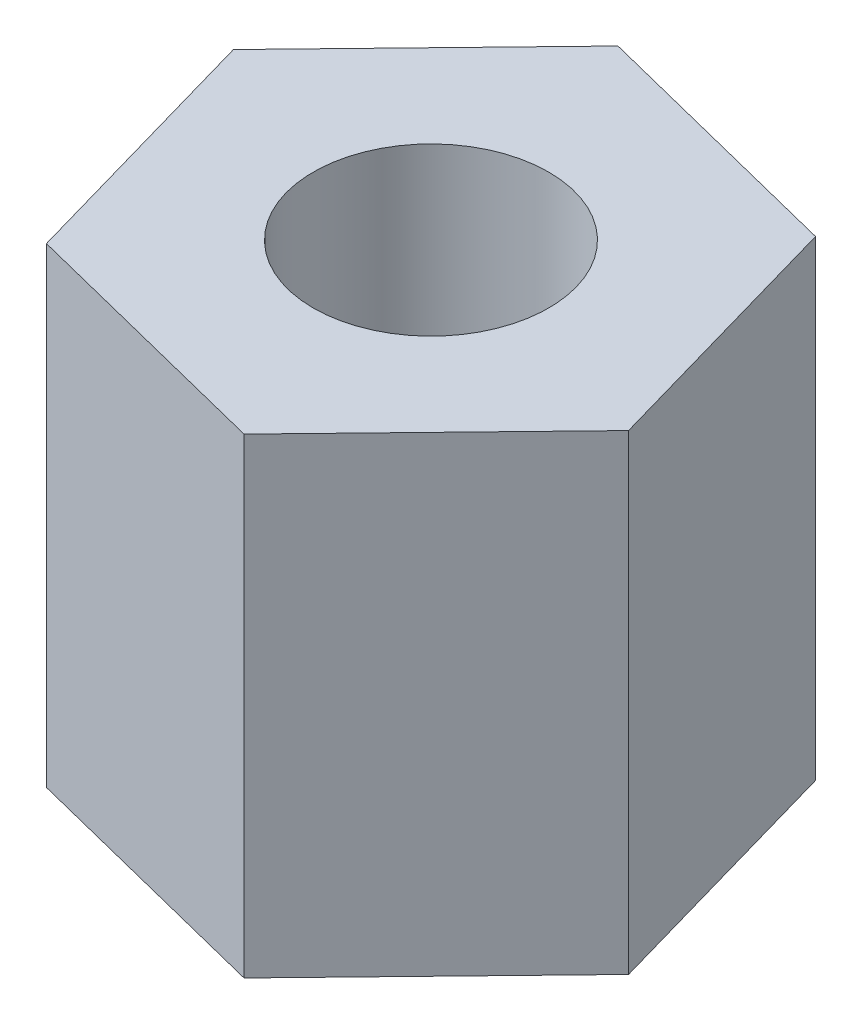
ISO-10303-21;
HEADER;
FILE_DESCRIPTION(('STEP AP214'),'2;1');
FILE_NAME('part.step','',(''),(''),'','','');
FILE_SCHEMA(('AUTOMOTIVE_DESIGN { 1 0 10303 214 1 1 1 1 }'));
ENDSEC;
DATA;
#1=APPLICATION_CONTEXT('core data for automotive mechanical design processes');
#2=APPLICATION_PROTOCOL_DEFINITION('international standard','automotive_design',2000,#1);
#3=PRODUCT_CONTEXT('',#1,'mechanical');
#4=PRODUCT('Part','Part','',(#3));
#5=PRODUCT_RELATED_PRODUCT_CATEGORY('part','',(#4));
#6=PRODUCT_DEFINITION_FORMATION('','',#4);
#7=PRODUCT_DEFINITION_CONTEXT('part definition',#1,'design');
#8=PRODUCT_DEFINITION('design','',#6,#7);
#9=PRODUCT_DEFINITION_SHAPE('','',#8);
#10=(LENGTH_UNIT() NAMED_UNIT(*) SI_UNIT(.MILLI.,.METRE.));
#11=(NAMED_UNIT(*) PLANE_ANGLE_UNIT() SI_UNIT($,.RADIAN.));
#12=(NAMED_UNIT(*) SI_UNIT($,.STERADIAN.) SOLID_ANGLE_UNIT());
#13=UNCERTAINTY_MEASURE_WITH_UNIT(LENGTH_MEASURE(1.E-05),#10,'distance_accuracy_value','');
#14=(GEOMETRIC_REPRESENTATION_CONTEXT(3) GLOBAL_UNCERTAINTY_ASSIGNED_CONTEXT((#13)) GLOBAL_UNIT_ASSIGNED_CONTEXT((#10,
#11,#12)) REPRESENTATION_CONTEXT('',''));
#15=CARTESIAN_POINT('',(0.,0.,0.));
#16=DIRECTION('',(0.,0.,1.));
#17=DIRECTION('',(1.,0.,0.));
#18=AXIS2_PLACEMENT_3D('',#15,#16,#17);
#19=CARTESIAN_POINT('',(0.,10.,0.));
#20=DIRECTION('',(0.,1.,0.));
#21=DIRECTION('',(0.,0.,1.));
#22=AXIS2_PLACEMENT_3D('',#19,#20,#21);
#23=PLANE('',#22);
#24=DIRECTION('',(-0.69571755837201,0.,0.718315445311381));
#25=VECTOR('',#24,1.);
#26=CARTESIAN_POINT('',(-1.58321362852676,10.,-5.55218587042801));
#27=LINE('',#26,#25);
#28=CARTESIAN_POINT('',(-1.58321362852676,10.,-5.55218587042801));
#29=VERTEX_POINT('',#28);
#30=CARTESIAN_POINT('',(-5.59994082458705,10.,-1.40498971329209));
#31=VERTEX_POINT('',#30);
#32=EDGE_CURVE('E128',#29,#31,#27,.T.);
#33=ORIENTED_EDGE('',*,*,#32,.T.);
#34=DIRECTION('',(0.274220644384383,0.,0.961666802064735));
#35=VECTOR('',#34,1.);
#36=CARTESIAN_POINT('',(-5.59994082458705,10.,-1.40498971329209));
#37=LINE('',#36,#35);
#38=CARTESIAN_POINT('',(-4.01672719606029,10.,4.14719615713592));
#39=VERTEX_POINT('',#38);
#40=EDGE_CURVE('E86',#31,#39,#37,.T.);
#41=ORIENTED_EDGE('',*,*,#40,.T.);
#42=DIRECTION('',(0.969938202756393,0.,0.243351356753353));
#43=VECTOR('',#42,1.);
#44=CARTESIAN_POINT('',(-4.01672719606029,10.,4.14719615713592));
#45=LINE('',#44,#43);
#46=CARTESIAN_POINT('',(1.58321362852677,10.,5.55218587042801));
#47=VERTEX_POINT('',#46);
#48=EDGE_CURVE('E99',#39,#47,#45,.T.);
#49=ORIENTED_EDGE('',*,*,#48,.T.);
#50=DIRECTION('',(0.69571755837201,0.,-0.718315445311382));
#51=VECTOR('',#50,1.);
#52=CARTESIAN_POINT('',(1.58321362852677,10.,5.55218587042801));
#53=LINE('',#52,#51);
#54=CARTESIAN_POINT('',(5.59994082458706,10.,1.4049897132921));
#55=VERTEX_POINT('',#54);
#56=EDGE_CURVE('E93',#47,#55,#53,.T.);
#57=ORIENTED_EDGE('',*,*,#56,.T.);
#58=DIRECTION('',(-0.274220644384383,0.,-0.961666802064735));
#59=VECTOR('',#58,1.);
#60=CARTESIAN_POINT('',(5.59994082458706,10.,1.4049897132921));
#61=LINE('',#60,#59);
#62=CARTESIAN_POINT('',(4.01672719606029,10.,-4.14719615713592));
#63=VERTEX_POINT('',#62);
#64=EDGE_CURVE('E97',#55,#63,#61,.T.);
#65=ORIENTED_EDGE('',*,*,#64,.T.);
#66=DIRECTION('',(-0.969938202756393,0.,-0.243351356753353));
#67=VECTOR('',#66,1.);
#68=CARTESIAN_POINT('',(4.01672719606029,10.,-4.14719615713592));
#69=LINE('',#68,#67);
#70=EDGE_CURVE('E49',#63,#29,#69,.T.);
#71=ORIENTED_EDGE('',*,*,#70,.T.);
#72=EDGE_LOOP('',(#33,#41,#49,#57,#65,#71));
#73=FACE_BOUND('',#72,.T.);
#74=CARTESIAN_POINT('',(0.,10.,0.));
#75=DIRECTION('',(0.,1.,0.));
#76=DIRECTION('',(0.,0.,1.));
#77=AXIS2_PLACEMENT_3D('',#74,#75,#76);
#78=CIRCLE('',#77,2.5);
#79=CARTESIAN_POINT('',(0.,10.,2.5));
#80=VERTEX_POINT('',#79);
#81=EDGE_CURVE('E121',#80,#80,#78,.T.);
#82=ORIENTED_EDGE('',*,*,#81,.F.);
#83=EDGE_LOOP('',(#82));
#84=FACE_BOUND('',#83,.T.);
#85=ADVANCED_FACE('F32',(#73,#84),#23,.T.);
#86=CARTESIAN_POINT('',(0.,0.,0.));
#87=DIRECTION('',(0.,1.,0.));
#88=DIRECTION('',(0.,0.,1.));
#89=AXIS2_PLACEMENT_3D('',#86,#87,#88);
#90=PLANE('',#89);
#91=DIRECTION('',(-0.69571755837201,0.,0.718315445311381));
#92=VECTOR('',#91,1.);
#93=CARTESIAN_POINT('',(-1.58321362852676,0.,-5.55218587042801));
#94=LINE('',#93,#92);
#95=CARTESIAN_POINT('',(-1.58321362852676,0.,-5.55218587042801));
#96=VERTEX_POINT('',#95);
#97=CARTESIAN_POINT('',(-5.59994082458705,0.,-1.40498971329209));
#98=VERTEX_POINT('',#97);
#99=EDGE_CURVE('E117',#96,#98,#94,.T.);
#100=ORIENTED_EDGE('',*,*,#99,.F.);
#101=DIRECTION('',(-0.969938202756393,0.,-0.243351356753353));
#102=VECTOR('',#101,1.);
#103=CARTESIAN_POINT('',(4.01672719606029,0.,-4.14719615713592));
#104=LINE('',#103,#102);
#105=CARTESIAN_POINT('',(4.01672719606029,0.,-4.14719615713592));
#106=VERTEX_POINT('',#105);
#107=EDGE_CURVE('E78',#106,#96,#104,.T.);
#108=ORIENTED_EDGE('',*,*,#107,.F.);
#109=DIRECTION('',(-0.274220644384383,0.,-0.961666802064735));
#110=VECTOR('',#109,1.);
#111=CARTESIAN_POINT('',(5.59994082458706,0.,1.4049897132921));
#112=LINE('',#111,#110);
#113=CARTESIAN_POINT('',(5.59994082458706,0.,1.4049897132921));
#114=VERTEX_POINT('',#113);
#115=EDGE_CURVE('E72',#114,#106,#112,.T.);
#116=ORIENTED_EDGE('',*,*,#115,.F.);
#117=DIRECTION('',(0.69571755837201,0.,-0.718315445311382));
#118=VECTOR('',#117,1.);
#119=CARTESIAN_POINT('',(1.58321362852677,0.,5.55218587042801));
#120=LINE('',#119,#118);
#121=CARTESIAN_POINT('',(1.58321362852677,0.,5.55218587042801));
#122=VERTEX_POINT('',#121);
#123=EDGE_CURVE('E107',#122,#114,#120,.T.);
#124=ORIENTED_EDGE('',*,*,#123,.F.);
#125=DIRECTION('',(0.969938202756393,0.,0.243351356753353));
#126=VECTOR('',#125,1.);
#127=CARTESIAN_POINT('',(-4.01672719606029,0.,4.14719615713592));
#128=LINE('',#127,#126);
#129=CARTESIAN_POINT('',(-4.01672719606029,0.,4.14719615713592));
#130=VERTEX_POINT('',#129);
#131=EDGE_CURVE('E123',#130,#122,#128,.T.);
#132=ORIENTED_EDGE('',*,*,#131,.F.);
#133=DIRECTION('',(0.274220644384383,0.,0.961666802064735));
#134=VECTOR('',#133,1.);
#135=CARTESIAN_POINT('',(-5.59994082458705,0.,-1.40498971329209));
#136=LINE('',#135,#134);
#137=EDGE_CURVE('E120',#98,#130,#136,.T.);
#138=ORIENTED_EDGE('',*,*,#137,.F.);
#139=EDGE_LOOP('',(#100,#108,#116,#124,#132,#138));
#140=FACE_BOUND('',#139,.T.);
#141=CARTESIAN_POINT('',(0.,0.,0.));
#142=DIRECTION('',(0.,1.,0.));
#143=DIRECTION('',(0.,0.,1.));
#144=AXIS2_PLACEMENT_3D('',#141,#142,#143);
#145=CIRCLE('',#144,2.5);
#146=CARTESIAN_POINT('',(0.,0.,2.5));
#147=VERTEX_POINT('',#146);
#148=EDGE_CURVE('E221',#147,#147,#145,.T.);
#149=ORIENTED_EDGE('',*,*,#148,.T.);
#150=EDGE_LOOP('',(#149));
#151=FACE_BOUND('',#150,.T.);
#152=ADVANCED_FACE('F137',(#140,#151),#90,.F.);
#153=CARTESIAN_POINT('',(-1.58321362852676,10.,-5.55218587042801));
#154=DIRECTION('',(0.718315445311381,0.,0.69571755837201));
#155=DIRECTION('',(0.695717558372011,0.,-0.718315445311381));
#156=AXIS2_PLACEMENT_3D('',#153,#154,#155);
#157=PLANE('',#156);
#158=ORIENTED_EDGE('',*,*,#99,.T.);
#159=DIRECTION('',(0.,-1.,0.));
#160=VECTOR('',#159,1.);
#161=CARTESIAN_POINT('',(-5.59994082458705,10.,-1.40498971329209));
#162=LINE('',#161,#160);
#163=EDGE_CURVE('E11',#31,#98,#162,.T.);
#164=ORIENTED_EDGE('',*,*,#163,.F.);
#165=ORIENTED_EDGE('',*,*,#32,.F.);
#166=DIRECTION('',(0.,-1.,0.));
#167=VECTOR('',#166,1.);
#168=CARTESIAN_POINT('',(-1.58321362852676,10.,-5.55218587042801));
#169=LINE('',#168,#167);
#170=EDGE_CURVE('E113',#29,#96,#169,.T.);
#171=ORIENTED_EDGE('',*,*,#170,.T.);
#172=EDGE_LOOP('',(#158,#164,#165,#171));
#173=FACE_BOUND('',#172,.T.);
#174=ADVANCED_FACE('F34',(#173),#157,.F.);
#175=CARTESIAN_POINT('',(-5.59994082458705,10.,-1.40498971329209));
#176=DIRECTION('',(0.961666802064735,0.,-0.274220644384383));
#177=DIRECTION('',(-0.274220644384383,0.,-0.961666802064735));
#178=AXIS2_PLACEMENT_3D('',#175,#176,#177);
#179=PLANE('',#178);
#180=ORIENTED_EDGE('',*,*,#137,.T.);
#181=DIRECTION('',(0.,-1.,0.));
#182=VECTOR('',#181,1.);
#183=CARTESIAN_POINT('',(-4.01672719606029,10.,4.14719615713592));
#184=LINE('',#183,#182);
#185=EDGE_CURVE('E41',#39,#130,#184,.T.);
#186=ORIENTED_EDGE('',*,*,#185,.F.);
#187=ORIENTED_EDGE('',*,*,#40,.F.);
#188=ORIENTED_EDGE('',*,*,#163,.T.);
#189=EDGE_LOOP('',(#180,#186,#187,#188));
#190=FACE_BOUND('',#189,.T.);
#191=ADVANCED_FACE('F162',(#190),#179,.F.);
#192=CARTESIAN_POINT('',(-4.01672719606029,10.,4.14719615713592));
#193=DIRECTION('',(0.243351356753353,0.,-0.969938202756393));
#194=DIRECTION('',(-0.969938202756393,0.,-0.243351356753353));
#195=AXIS2_PLACEMENT_3D('',#192,#193,#194);
#196=PLANE('',#195);
#197=ORIENTED_EDGE('',*,*,#131,.T.);
#198=DIRECTION('',(0.,-1.,0.));
#199=VECTOR('',#198,1.);
#200=CARTESIAN_POINT('',(1.58321362852677,10.,5.55218587042801));
#201=LINE('',#200,#199);
#202=EDGE_CURVE('E108',#47,#122,#201,.T.);
#203=ORIENTED_EDGE('',*,*,#202,.F.);
#204=ORIENTED_EDGE('',*,*,#48,.F.);
#205=ORIENTED_EDGE('',*,*,#185,.T.);
#206=EDGE_LOOP('',(#197,#203,#204,#205));
#207=FACE_BOUND('',#206,.T.);
#208=ADVANCED_FACE('F134',(#207),#196,.F.);
#209=CARTESIAN_POINT('',(1.58321362852677,10.,5.55218587042801));
#210=DIRECTION('',(-0.718315445311382,0.,-0.69571755837201));
#211=DIRECTION('',(-0.69571755837201,0.,0.718315445311382));
#212=AXIS2_PLACEMENT_3D('',#209,#210,#211);
#213=PLANE('',#212);
#214=ORIENTED_EDGE('',*,*,#123,.T.);
#215=DIRECTION('',(0.,-1.,0.));
#216=VECTOR('',#215,1.);
#217=CARTESIAN_POINT('',(5.59994082458706,10.,1.4049897132921));
#218=LINE('',#217,#216);
#219=EDGE_CURVE('E104',#55,#114,#218,.T.);
#220=ORIENTED_EDGE('',*,*,#219,.F.);
#221=ORIENTED_EDGE('',*,*,#56,.F.);
#222=ORIENTED_EDGE('',*,*,#202,.T.);
#223=EDGE_LOOP('',(#214,#220,#221,#222));
#224=FACE_BOUND('',#223,.T.);
#225=ADVANCED_FACE('F105',(#224),#213,.F.);
#226=CARTESIAN_POINT('',(5.59994082458706,10.,1.4049897132921));
#227=DIRECTION('',(-0.961666802064735,0.,0.274220644384383));
#228=DIRECTION('',(0.274220644384383,0.,0.961666802064735));
#229=AXIS2_PLACEMENT_3D('',#226,#227,#228);
#230=PLANE('',#229);
#231=ORIENTED_EDGE('',*,*,#115,.T.);
#232=DIRECTION('',(0.,-1.,0.));
#233=VECTOR('',#232,1.);
#234=CARTESIAN_POINT('',(4.01672719606029,10.,-4.14719615713592));
#235=LINE('',#234,#233);
#236=EDGE_CURVE('E109',#63,#106,#235,.T.);
#237=ORIENTED_EDGE('',*,*,#236,.F.);
#238=ORIENTED_EDGE('',*,*,#64,.F.);
#239=ORIENTED_EDGE('',*,*,#219,.T.);
#240=EDGE_LOOP('',(#231,#237,#238,#239));
#241=FACE_BOUND('',#240,.T.);
#242=ADVANCED_FACE('F111',(#241),#230,.F.);
#243=CARTESIAN_POINT('',(4.01672719606029,10.,-4.14719615713592));
#244=DIRECTION('',(-0.243351356753353,0.,0.969938202756393));
#245=DIRECTION('',(0.969938202756393,0.,0.243351356753353));
#246=AXIS2_PLACEMENT_3D('',#243,#244,#245);
#247=PLANE('',#246);
#248=ORIENTED_EDGE('',*,*,#107,.T.);
#249=ORIENTED_EDGE('',*,*,#170,.F.);
#250=ORIENTED_EDGE('',*,*,#70,.F.);
#251=ORIENTED_EDGE('',*,*,#236,.T.);
#252=EDGE_LOOP('',(#248,#249,#250,#251));
#253=FACE_BOUND('',#252,.T.);
#254=ADVANCED_FACE('F142',(#253),#247,.F.);
#255=CARTESIAN_POINT('',(0.,10.,0.));
#256=DIRECTION('',(0.,-1.,0.));
#257=DIRECTION('',(0.,0.,-1.));
#258=AXIS2_PLACEMENT_3D('',#255,#256,#257);
#259=CYLINDRICAL_SURFACE('',#258,2.5);
#260=ORIENTED_EDGE('',*,*,#81,.T.);
#261=EDGE_LOOP('',(#260));
#262=FACE_BOUND('',#261,.T.);
#263=ORIENTED_EDGE('',*,*,#148,.F.);
#264=EDGE_LOOP('',(#263));
#265=FACE_BOUND('',#264,.T.);
#266=ADVANCED_FACE('F144',(#262,#265),#259,.F.);
#267=CLOSED_SHELL('',(#85,#152,#174,#191,#208,#225,#242,#254,#266));
#268=MANIFOLD_SOLID_BREP('B2',#267);
#269=ADVANCED_BREP_SHAPE_REPRESENTATION('',(#18,#268),#14);
#270=SHAPE_DEFINITION_REPRESENTATION(#9,#269);
ENDSEC;
END-ISO-10303-21;
